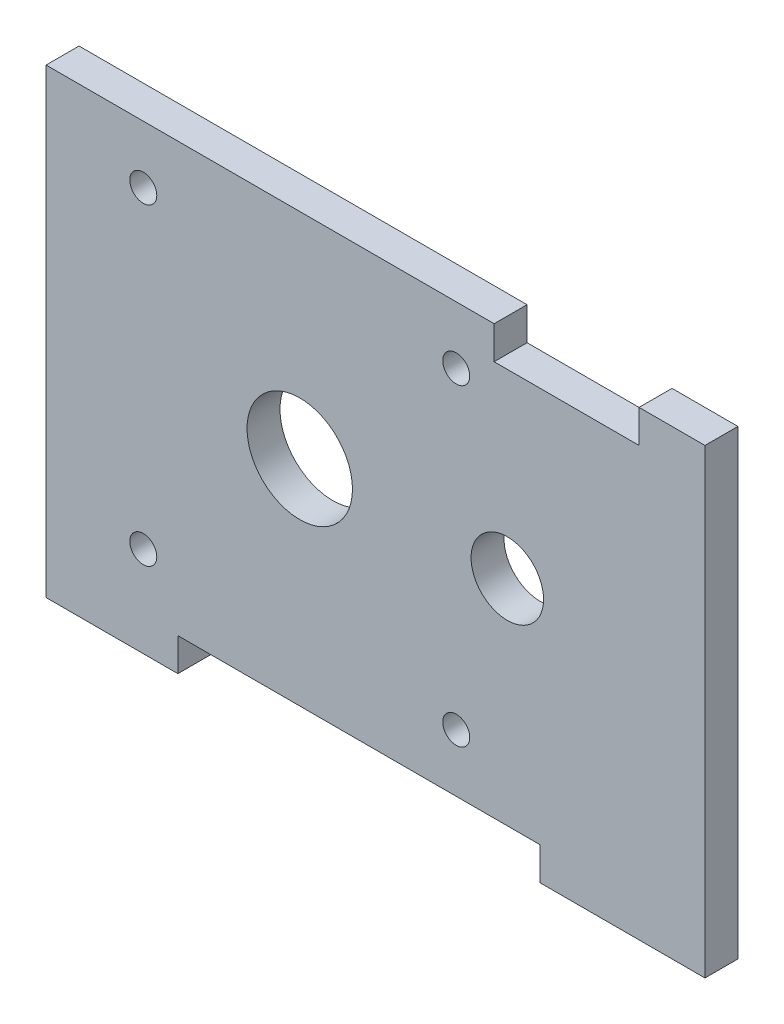
ISO-10303-21;
HEADER;
FILE_DESCRIPTION(('STEP AP214'),'2;1');
FILE_NAME('part.step','',(''),(''),'','','');
FILE_SCHEMA(('AUTOMOTIVE_DESIGN { 1 0 10303 214 1 1 1 1 }'));
ENDSEC;
DATA;
#1=APPLICATION_CONTEXT('core data for automotive mechanical design processes');
#2=APPLICATION_PROTOCOL_DEFINITION('international standard','automotive_design',2000,#1);
#3=PRODUCT_CONTEXT('',#1,'mechanical');
#4=PRODUCT('Part','Part','',(#3));
#5=PRODUCT_RELATED_PRODUCT_CATEGORY('part','',(#4));
#6=PRODUCT_DEFINITION_FORMATION('','',#4);
#7=PRODUCT_DEFINITION_CONTEXT('part definition',#1,'design');
#8=PRODUCT_DEFINITION('design','',#6,#7);
#9=PRODUCT_DEFINITION_SHAPE('','',#8);
#10=(LENGTH_UNIT() NAMED_UNIT(*) SI_UNIT(.MILLI.,.METRE.));
#11=(NAMED_UNIT(*) PLANE_ANGLE_UNIT() SI_UNIT($,.RADIAN.));
#12=(NAMED_UNIT(*) SI_UNIT($,.STERADIAN.) SOLID_ANGLE_UNIT());
#13=UNCERTAINTY_MEASURE_WITH_UNIT(LENGTH_MEASURE(1.E-05),#10,'distance_accuracy_value','');
#14=(GEOMETRIC_REPRESENTATION_CONTEXT(3) GLOBAL_UNCERTAINTY_ASSIGNED_CONTEXT((#13)) GLOBAL_UNIT_ASSIGNED_CONTEXT((#10,
#11,#12)) REPRESENTATION_CONTEXT('',''));
#15=CARTESIAN_POINT('',(0.,0.,0.));
#16=DIRECTION('',(0.,0.,1.));
#17=DIRECTION('',(1.,0.,0.));
#18=AXIS2_PLACEMENT_3D('',#15,#16,#17);
#19=CARTESIAN_POINT('',(0.,82.55,6.35));
#20=DIRECTION('',(0.,-1.,0.));
#21=DIRECTION('',(1.,0.,0.));
#22=AXIS2_PLACEMENT_3D('',#19,#20,#21);
#23=PLANE('',#22);
#24=DIRECTION('',(-1.,0.,0.));
#25=VECTOR('',#24,1.);
#26=CARTESIAN_POINT('',(0.,82.55,0.));
#27=LINE('',#26,#25);
#28=CARTESIAN_POINT('',(0.,82.55,0.));
#29=VERTEX_POINT('',#28);
#30=CARTESIAN_POINT('',(-12.7,82.55,0.));
#31=VERTEX_POINT('',#30);
#32=EDGE_CURVE('E197',#29,#31,#27,.T.);
#33=ORIENTED_EDGE('',*,*,#32,.T.);
#34=DIRECTION('',(0.,0.,-1.));
#35=VECTOR('',#34,1.);
#36=CARTESIAN_POINT('',(-12.7,82.55,6.35));
#37=LINE('',#36,#35);
#38=CARTESIAN_POINT('',(-12.7,82.55,6.35));
#39=VERTEX_POINT('',#38);
#40=EDGE_CURVE('E267',#39,#31,#37,.T.);
#41=ORIENTED_EDGE('',*,*,#40,.F.);
#42=DIRECTION('',(-1.,0.,0.));
#43=VECTOR('',#42,1.);
#44=CARTESIAN_POINT('',(0.,82.55,6.35));
#45=LINE('',#44,#43);
#46=CARTESIAN_POINT('',(0.,82.55,6.35));
#47=VERTEX_POINT('',#46);
#48=EDGE_CURVE('E167',#47,#39,#45,.T.);
#49=ORIENTED_EDGE('',*,*,#48,.F.);
#50=DIRECTION('',(0.,0.,-1.));
#51=VECTOR('',#50,1.);
#52=CARTESIAN_POINT('',(0.,82.55,6.35));
#53=LINE('',#52,#51);
#54=EDGE_CURVE('E143',#47,#29,#53,.T.);
#55=ORIENTED_EDGE('',*,*,#54,.T.);
#56=EDGE_LOOP('',(#33,#41,#49,#55));
#57=FACE_BOUND('',#56,.T.);
#58=ADVANCED_FACE('F43',(#57),#23,.F.);
#59=CARTESIAN_POINT('',(-127.,0.,6.35));
#60=DIRECTION('',(1.,0.,0.));
#61=DIRECTION('',(0.,1.,0.));
#62=AXIS2_PLACEMENT_3D('',#59,#60,#61);
#63=PLANE('',#62);
#64=DIRECTION('',(0.,-1.,0.));
#65=VECTOR('',#64,1.);
#66=CARTESIAN_POINT('',(-127.,0.,0.));
#67=LINE('',#66,#65);
#68=CARTESIAN_POINT('',(-127.,82.55,0.));
#69=VERTEX_POINT('',#68);
#70=CARTESIAN_POINT('',(-127.,-6.35,0.));
#71=VERTEX_POINT('',#70);
#72=EDGE_CURVE('E179',#69,#71,#67,.T.);
#73=ORIENTED_EDGE('',*,*,#72,.T.);
#74=DIRECTION('',(0.,0.,-1.));
#75=VECTOR('',#74,1.);
#76=CARTESIAN_POINT('',(-127.,-6.35,6.35));
#77=LINE('',#76,#75);
#78=CARTESIAN_POINT('',(-127.,-6.35,6.35));
#79=VERTEX_POINT('',#78);
#80=EDGE_CURVE('E11',#79,#71,#77,.T.);
#81=ORIENTED_EDGE('',*,*,#80,.F.);
#82=DIRECTION('',(0.,-1.,0.));
#83=VECTOR('',#82,1.);
#84=CARTESIAN_POINT('',(-127.,0.,6.35));
#85=LINE('',#84,#83);
#86=CARTESIAN_POINT('',(-127.,82.55,6.35));
#87=VERTEX_POINT('',#86);
#88=EDGE_CURVE('E232',#87,#79,#85,.T.);
#89=ORIENTED_EDGE('',*,*,#88,.F.);
#90=DIRECTION('',(0.,0.,-1.));
#91=VECTOR('',#90,1.);
#92=CARTESIAN_POINT('',(-127.,82.55,6.35));
#93=LINE('',#92,#91);
#94=EDGE_CURVE('E169',#87,#69,#93,.T.);
#95=ORIENTED_EDGE('',*,*,#94,.T.);
#96=EDGE_LOOP('',(#73,#81,#89,#95));
#97=FACE_BOUND('',#96,.T.);
#98=ADVANCED_FACE('F330',(#97),#63,.F.);
#99=CARTESIAN_POINT('',(0.,-6.35,6.35));
#100=DIRECTION('',(0.,1.,0.));
#101=DIRECTION('',(0.,0.,1.));
#102=AXIS2_PLACEMENT_3D('',#99,#100,#101);
#103=PLANE('',#102);
#104=DIRECTION('',(1.,0.,0.));
#105=VECTOR('',#104,1.);
#106=CARTESIAN_POINT('',(0.,-6.35,0.));
#107=LINE('',#106,#105);
#108=CARTESIAN_POINT('',(-101.6,-6.35,0.));
#109=VERTEX_POINT('',#108);
#110=EDGE_CURVE('E183',#71,#109,#107,.T.);
#111=ORIENTED_EDGE('',*,*,#110,.T.);
#112=DIRECTION('',(0.,0.,-1.));
#113=VECTOR('',#112,1.);
#114=CARTESIAN_POINT('',(-101.6,-6.35,6.35));
#115=LINE('',#114,#113);
#116=CARTESIAN_POINT('',(-101.6,-6.35,6.35));
#117=VERTEX_POINT('',#116);
#118=EDGE_CURVE('E51',#117,#109,#115,.T.);
#119=ORIENTED_EDGE('',*,*,#118,.F.);
#120=DIRECTION('',(1.,0.,0.));
#121=VECTOR('',#120,1.);
#122=CARTESIAN_POINT('',(0.,-6.35,6.35));
#123=LINE('',#122,#121);
#124=EDGE_CURVE('E114',#79,#117,#123,.T.);
#125=ORIENTED_EDGE('',*,*,#124,.F.);
#126=ORIENTED_EDGE('',*,*,#80,.T.);
#127=EDGE_LOOP('',(#111,#119,#125,#126));
#128=FACE_BOUND('',#127,.T.);
#129=ADVANCED_FACE('F331',(#128),#103,.F.);
#130=CARTESIAN_POINT('',(-101.6,0.,6.35));
#131=DIRECTION('',(-1.,0.,0.));
#132=DIRECTION('',(0.,0.,1.));
#133=AXIS2_PLACEMENT_3D('',#130,#131,#132);
#134=PLANE('',#133);
#135=DIRECTION('',(0.,1.,0.));
#136=VECTOR('',#135,1.);
#137=CARTESIAN_POINT('',(-101.6,0.,0.));
#138=LINE('',#137,#136);
#139=CARTESIAN_POINT('',(-101.6,0.,0.));
#140=VERTEX_POINT('',#139);
#141=EDGE_CURVE('E185',#109,#140,#138,.T.);
#142=ORIENTED_EDGE('',*,*,#141,.T.);
#143=DIRECTION('',(0.,0.,-1.));
#144=VECTOR('',#143,1.);
#145=CARTESIAN_POINT('',(-101.6,0.,6.35));
#146=LINE('',#145,#144);
#147=CARTESIAN_POINT('',(-101.6,0.,6.35));
#148=VERTEX_POINT('',#147);
#149=EDGE_CURVE('E207',#148,#140,#146,.T.);
#150=ORIENTED_EDGE('',*,*,#149,.F.);
#151=DIRECTION('',(0.,1.,0.));
#152=VECTOR('',#151,1.);
#153=CARTESIAN_POINT('',(-101.6,0.,6.35));
#154=LINE('',#153,#152);
#155=EDGE_CURVE('E215',#117,#148,#154,.T.);
#156=ORIENTED_EDGE('',*,*,#155,.F.);
#157=ORIENTED_EDGE('',*,*,#118,.T.);
#158=EDGE_LOOP('',(#142,#150,#156,#157));
#159=FACE_BOUND('',#158,.T.);
#160=ADVANCED_FACE('F213',(#159),#134,.F.);
#161=CARTESIAN_POINT('',(0.,0.,6.35));
#162=DIRECTION('',(0.,1.,0.));
#163=DIRECTION('',(0.,0.,1.));
#164=AXIS2_PLACEMENT_3D('',#161,#162,#163);
#165=PLANE('',#164);
#166=DIRECTION('',(1.,0.,0.));
#167=VECTOR('',#166,1.);
#168=CARTESIAN_POINT('',(0.,0.,0.));
#169=LINE('',#168,#167);
#170=CARTESIAN_POINT('',(-31.75,0.,0.));
#171=VERTEX_POINT('',#170);
#172=EDGE_CURVE('E187',#140,#171,#169,.T.);
#173=ORIENTED_EDGE('',*,*,#172,.T.);
#174=DIRECTION('',(0.,0.,-1.));
#175=VECTOR('',#174,1.);
#176=CARTESIAN_POINT('',(-31.75,0.,6.35));
#177=LINE('',#176,#175);
#178=CARTESIAN_POINT('',(-31.75,0.,6.35));
#179=VERTEX_POINT('',#178);
#180=EDGE_CURVE('E205',#179,#171,#177,.T.);
#181=ORIENTED_EDGE('',*,*,#180,.F.);
#182=DIRECTION('',(1.,0.,0.));
#183=VECTOR('',#182,1.);
#184=CARTESIAN_POINT('',(0.,0.,6.35));
#185=LINE('',#184,#183);
#186=EDGE_CURVE('E163',#148,#179,#185,.T.);
#187=ORIENTED_EDGE('',*,*,#186,.F.);
#188=ORIENTED_EDGE('',*,*,#149,.T.);
#189=EDGE_LOOP('',(#173,#181,#187,#188));
#190=FACE_BOUND('',#189,.T.);
#191=ADVANCED_FACE('F224',(#190),#165,.F.);
#192=CARTESIAN_POINT('',(-31.75,0.,6.35));
#193=DIRECTION('',(-1.,0.,0.));
#194=DIRECTION('',(0.,0.,1.));
#195=AXIS2_PLACEMENT_3D('',#192,#193,#194);
#196=PLANE('',#195);
#197=DIRECTION('',(0.,1.,0.));
#198=VECTOR('',#197,1.);
#199=CARTESIAN_POINT('',(-31.75,0.,0.));
#200=LINE('',#199,#198);
#201=CARTESIAN_POINT('',(-31.75,-6.35,0.));
#202=VERTEX_POINT('',#201);
#203=EDGE_CURVE('E191',#202,#171,#200,.T.);
#204=ORIENTED_EDGE('',*,*,#203,.F.);
#205=DIRECTION('',(0.,0.,-1.));
#206=VECTOR('',#205,1.);
#207=CARTESIAN_POINT('',(-31.75,-6.35,6.35));
#208=LINE('',#207,#206);
#209=CARTESIAN_POINT('',(-31.75,-6.35,6.35));
#210=VERTEX_POINT('',#209);
#211=EDGE_CURVE('E142',#210,#202,#208,.T.);
#212=ORIENTED_EDGE('',*,*,#211,.F.);
#213=DIRECTION('',(0.,1.,0.));
#214=VECTOR('',#213,1.);
#215=CARTESIAN_POINT('',(-31.75,0.,6.35));
#216=LINE('',#215,#214);
#217=EDGE_CURVE('E158',#210,#179,#216,.T.);
#218=ORIENTED_EDGE('',*,*,#217,.T.);
#219=ORIENTED_EDGE('',*,*,#180,.T.);
#220=EDGE_LOOP('',(#204,#212,#218,#219));
#221=FACE_BOUND('',#220,.T.);
#222=ADVANCED_FACE('F490',(#221),#196,.T.);
#223=CARTESIAN_POINT('',(0.,-6.35,6.35));
#224=DIRECTION('',(0.,-1.,0.));
#225=DIRECTION('',(1.,0.,0.));
#226=AXIS2_PLACEMENT_3D('',#223,#224,#225);
#227=PLANE('',#226);
#228=DIRECTION('',(-1.,0.,0.));
#229=VECTOR('',#228,1.);
#230=CARTESIAN_POINT('',(0.,-6.35,0.));
#231=LINE('',#230,#229);
#232=CARTESIAN_POINT('',(0.,-6.35,0.));
#233=VERTEX_POINT('',#232);
#234=EDGE_CURVE('E138',#233,#202,#231,.T.);
#235=ORIENTED_EDGE('',*,*,#234,.F.);
#236=DIRECTION('',(0.,0.,-1.));
#237=VECTOR('',#236,1.);
#238=CARTESIAN_POINT('',(0.,-6.35,6.35));
#239=LINE('',#238,#237);
#240=CARTESIAN_POINT('',(0.,-6.35,6.35));
#241=VERTEX_POINT('',#240);
#242=EDGE_CURVE('E132',#241,#233,#239,.T.);
#243=ORIENTED_EDGE('',*,*,#242,.F.);
#244=DIRECTION('',(-1.,0.,0.));
#245=VECTOR('',#244,1.);
#246=CARTESIAN_POINT('',(0.,-6.35,6.35));
#247=LINE('',#246,#245);
#248=EDGE_CURVE('E136',#241,#210,#247,.T.);
#249=ORIENTED_EDGE('',*,*,#248,.T.);
#250=ORIENTED_EDGE('',*,*,#211,.T.);
#251=EDGE_LOOP('',(#235,#243,#249,#250));
#252=FACE_BOUND('',#251,.T.);
#253=ADVANCED_FACE('F134',(#252),#227,.T.);
#254=CARTESIAN_POINT('',(0.,0.,6.35));
#255=DIRECTION('',(-1.,0.,0.));
#256=DIRECTION('',(0.,0.,1.));
#257=AXIS2_PLACEMENT_3D('',#254,#255,#256);
#258=PLANE('',#257);
#259=DIRECTION('',(0.,1.,0.));
#260=VECTOR('',#259,1.);
#261=CARTESIAN_POINT('',(0.,0.,0.));
#262=LINE('',#261,#260);
#263=EDGE_CURVE('E195',#233,#29,#262,.T.);
#264=ORIENTED_EDGE('',*,*,#263,.T.);
#265=ORIENTED_EDGE('',*,*,#54,.F.);
#266=DIRECTION('',(0.,1.,0.));
#267=VECTOR('',#266,1.);
#268=CARTESIAN_POINT('',(0.,0.,6.35));
#269=LINE('',#268,#267);
#270=EDGE_CURVE('E146',#241,#47,#269,.T.);
#271=ORIENTED_EDGE('',*,*,#270,.F.);
#272=ORIENTED_EDGE('',*,*,#242,.T.);
#273=EDGE_LOOP('',(#264,#265,#271,#272));
#274=FACE_BOUND('',#273,.T.);
#275=ADVANCED_FACE('F147',(#274),#258,.F.);
#276=CARTESIAN_POINT('',(-38.1,41.275,6.35));
#277=DIRECTION('',(0.,0.,-1.));
#278=DIRECTION('',(-1.,0.,0.));
#279=AXIS2_PLACEMENT_3D('',#276,#277,#278);
#280=CYLINDRICAL_SURFACE('',#279,6.98500000000001);
#281=CARTESIAN_POINT('',(-38.1,41.275,6.35));
#282=DIRECTION('',(0.,0.,1.));
#283=DIRECTION('',(1.,0.,0.));
#284=AXIS2_PLACEMENT_3D('',#281,#282,#283);
#285=CIRCLE('',#284,6.98500000000001);
#286=CARTESIAN_POINT('',(-31.115,41.275,6.35));
#287=VERTEX_POINT('',#286);
#288=EDGE_CURVE('E235',#287,#287,#285,.T.);
#289=ORIENTED_EDGE('',*,*,#288,.T.);
#290=EDGE_LOOP('',(#289));
#291=FACE_BOUND('',#290,.T.);
#292=CARTESIAN_POINT('',(-38.1,41.275,0.));
#293=DIRECTION('',(0.,0.,1.));
#294=DIRECTION('',(1.,0.,0.));
#295=AXIS2_PLACEMENT_3D('',#292,#293,#294);
#296=CIRCLE('',#295,6.98500000000001);
#297=CARTESIAN_POINT('',(-31.115,41.275,0.));
#298=VERTEX_POINT('',#297);
#299=EDGE_CURVE('E174',#298,#298,#296,.T.);
#300=ORIENTED_EDGE('',*,*,#299,.F.);
#301=EDGE_LOOP('',(#300));
#302=FACE_BOUND('',#301,.T.);
#303=ADVANCED_FACE('F352',(#291,#302),#280,.F.);
#304=CARTESIAN_POINT('',(-78.105,41.275,6.35));
#305=DIRECTION('',(0.,0.,-1.));
#306=DIRECTION('',(-1.,0.,0.));
#307=AXIS2_PLACEMENT_3D('',#304,#305,#306);
#308=CYLINDRICAL_SURFACE('',#307,10.16);
#309=CARTESIAN_POINT('',(-78.105,41.275,6.35));
#310=DIRECTION('',(0.,0.,1.));
#311=DIRECTION('',(1.,0.,0.));
#312=AXIS2_PLACEMENT_3D('',#309,#310,#311);
#313=CIRCLE('',#312,10.16);
#314=CARTESIAN_POINT('',(-67.945,41.275,6.35));
#315=VERTEX_POINT('',#314);
#316=EDGE_CURVE('E200',#315,#315,#313,.T.);
#317=ORIENTED_EDGE('',*,*,#316,.T.);
#318=EDGE_LOOP('',(#317));
#319=FACE_BOUND('',#318,.T.);
#320=CARTESIAN_POINT('',(-78.105,41.275,0.));
#321=DIRECTION('',(0.,0.,1.));
#322=DIRECTION('',(1.,0.,0.));
#323=AXIS2_PLACEMENT_3D('',#320,#321,#322);
#324=CIRCLE('',#323,10.16);
#325=CARTESIAN_POINT('',(-67.945,41.275,0.));
#326=VERTEX_POINT('',#325);
#327=EDGE_CURVE('E170',#326,#326,#324,.T.);
#328=ORIENTED_EDGE('',*,*,#327,.F.);
#329=EDGE_LOOP('',(#328));
#330=FACE_BOUND('',#329,.T.);
#331=ADVANCED_FACE('F45',(#319,#330),#308,.F.);
#332=CARTESIAN_POINT('',(-40.64,82.55,6.35));
#333=VERTEX_POINT('',#332);
#334=EDGE_CURVE('E70',#333,#87,#45,.T.);
#335=ORIENTED_EDGE('',*,*,#334,.F.);
#336=DIRECTION('',(0.,0.,-1.));
#337=VECTOR('',#336,1.);
#338=CARTESIAN_POINT('',(-40.64,82.55,6.35));
#339=LINE('',#338,#337);
#340=CARTESIAN_POINT('',(-40.64,82.55,0.));
#341=VERTEX_POINT('',#340);
#342=EDGE_CURVE('E278',#333,#341,#339,.T.);
#343=ORIENTED_EDGE('',*,*,#342,.T.);
#344=EDGE_CURVE('E106',#341,#69,#27,.T.);
#345=ORIENTED_EDGE('',*,*,#344,.T.);
#346=ORIENTED_EDGE('',*,*,#94,.F.);
#347=EDGE_LOOP('',(#335,#343,#345,#346));
#348=FACE_BOUND('',#347,.T.);
#349=ADVANCED_FACE('F324',(#348),#23,.F.);
#350=CARTESIAN_POINT('',(0.,0.,6.35));
#351=DIRECTION('',(0.,0.,1.));
#352=DIRECTION('',(1.,0.,0.));
#353=AXIS2_PLACEMENT_3D('',#350,#351,#352);
#354=PLANE('',#353);
#355=DIRECTION('',(0.,-1.,0.));
#356=VECTOR('',#355,1.);
#357=CARTESIAN_POINT('',(-12.7,82.55,6.35));
#358=LINE('',#357,#356);
#359=CARTESIAN_POINT('',(-12.7,76.2,6.35));
#360=VERTEX_POINT('',#359);
#361=EDGE_CURVE('E285',#39,#360,#358,.T.);
#362=ORIENTED_EDGE('',*,*,#361,.T.);
#363=DIRECTION('',(-1.,0.,0.));
#364=VECTOR('',#363,1.);
#365=CARTESIAN_POINT('',(-12.7,76.2,6.35));
#366=LINE('',#365,#364);
#367=CARTESIAN_POINT('',(-40.64,76.2,6.35));
#368=VERTEX_POINT('',#367);
#369=EDGE_CURVE('E293',#360,#368,#366,.T.);
#370=ORIENTED_EDGE('',*,*,#369,.T.);
#371=DIRECTION('',(0.,1.,0.));
#372=VECTOR('',#371,1.);
#373=CARTESIAN_POINT('',(-40.64,82.55,6.35));
#374=LINE('',#373,#372);
#375=EDGE_CURVE('E274',#368,#333,#374,.T.);
#376=ORIENTED_EDGE('',*,*,#375,.T.);
#377=ORIENTED_EDGE('',*,*,#334,.T.);
#378=ORIENTED_EDGE('',*,*,#88,.T.);
#379=ORIENTED_EDGE('',*,*,#124,.T.);
#380=ORIENTED_EDGE('',*,*,#155,.T.);
#381=ORIENTED_EDGE('',*,*,#186,.T.);
#382=ORIENTED_EDGE('',*,*,#217,.F.);
#383=ORIENTED_EDGE('',*,*,#248,.F.);
#384=ORIENTED_EDGE('',*,*,#270,.T.);
#385=ORIENTED_EDGE('',*,*,#48,.T.);
#386=EDGE_LOOP('',(#362,#370,#376,#377,#378,#379,#380,#381,#382,#383,#384,#385));
#387=FACE_BOUND('',#386,.T.);
#388=CARTESIAN_POINT('',(-47.9425,11.1125,6.35));
#389=DIRECTION('',(0.,0.,1.));
#390=DIRECTION('',(1.,0.,0.));
#391=AXIS2_PLACEMENT_3D('',#388,#389,#390);
#392=CIRCLE('',#391,2.6035);
#393=CARTESIAN_POINT('',(-45.339,11.1125,6.35));
#394=VERTEX_POINT('',#393);
#395=EDGE_CURVE('E263',#394,#394,#392,.T.);
#396=ORIENTED_EDGE('',*,*,#395,.F.);
#397=EDGE_LOOP('',(#396));
#398=FACE_BOUND('',#397,.T.);
#399=CARTESIAN_POINT('',(-108.2675,11.1125,6.35));
#400=DIRECTION('',(0.,0.,1.));
#401=DIRECTION('',(1.,0.,0.));
#402=AXIS2_PLACEMENT_3D('',#399,#400,#401);
#403=CIRCLE('',#402,2.60349999999999);
#404=CARTESIAN_POINT('',(-105.664,11.1125,6.35));
#405=VERTEX_POINT('',#404);
#406=EDGE_CURVE('E257',#405,#405,#403,.T.);
#407=ORIENTED_EDGE('',*,*,#406,.F.);
#408=EDGE_LOOP('',(#407));
#409=FACE_BOUND('',#408,.T.);
#410=CARTESIAN_POINT('',(-47.9425,71.4375,6.35));
#411=DIRECTION('',(0.,0.,1.));
#412=DIRECTION('',(1.,0.,0.));
#413=AXIS2_PLACEMENT_3D('',#410,#411,#412);
#414=CIRCLE('',#413,2.6035);
#415=CARTESIAN_POINT('',(-45.339,71.4375,6.35));
#416=VERTEX_POINT('',#415);
#417=EDGE_CURVE('E249',#416,#416,#414,.T.);
#418=ORIENTED_EDGE('',*,*,#417,.F.);
#419=EDGE_LOOP('',(#418));
#420=FACE_BOUND('',#419,.T.);
#421=CARTESIAN_POINT('',(-108.2675,71.4375,6.35));
#422=DIRECTION('',(0.,0.,1.));
#423=DIRECTION('',(1.,0.,0.));
#424=AXIS2_PLACEMENT_3D('',#421,#422,#423);
#425=CIRCLE('',#424,2.60349999999999);
#426=CARTESIAN_POINT('',(-105.664,71.4375,6.35));
#427=VERTEX_POINT('',#426);
#428=EDGE_CURVE('E241',#427,#427,#425,.T.);
#429=ORIENTED_EDGE('',*,*,#428,.F.);
#430=EDGE_LOOP('',(#429));
#431=FACE_BOUND('',#430,.T.);
#432=ORIENTED_EDGE('',*,*,#316,.F.);
#433=EDGE_LOOP('',(#432));
#434=FACE_BOUND('',#433,.T.);
#435=ORIENTED_EDGE('',*,*,#288,.F.);
#436=EDGE_LOOP('',(#435));
#437=FACE_BOUND('',#436,.T.);
#438=ADVANCED_FACE('F155',(#387,#398,#409,#420,#431,#434,#437),#354,.T.);
#439=CARTESIAN_POINT('',(0.,0.,0.));
#440=DIRECTION('',(0.,0.,1.));
#441=DIRECTION('',(1.,0.,0.));
#442=AXIS2_PLACEMENT_3D('',#439,#440,#441);
#443=PLANE('',#442);
#444=CARTESIAN_POINT('',(-47.9425,11.1125,0.));
#445=DIRECTION('',(0.,0.,1.));
#446=DIRECTION('',(1.,0.,0.));
#447=AXIS2_PLACEMENT_3D('',#444,#445,#446);
#448=CIRCLE('',#447,2.6035);
#449=CARTESIAN_POINT('',(-45.339,11.1125,0.));
#450=VERTEX_POINT('',#449);
#451=EDGE_CURVE('E260',#450,#450,#448,.T.);
#452=ORIENTED_EDGE('',*,*,#451,.T.);
#453=EDGE_LOOP('',(#452));
#454=FACE_BOUND('',#453,.T.);
#455=CARTESIAN_POINT('',(-108.2675,11.1125,0.));
#456=DIRECTION('',(0.,0.,1.));
#457=DIRECTION('',(1.,0.,0.));
#458=AXIS2_PLACEMENT_3D('',#455,#456,#457);
#459=CIRCLE('',#458,2.60349999999999);
#460=CARTESIAN_POINT('',(-105.664,11.1125,0.));
#461=VERTEX_POINT('',#460);
#462=EDGE_CURVE('E253',#461,#461,#459,.T.);
#463=ORIENTED_EDGE('',*,*,#462,.T.);
#464=EDGE_LOOP('',(#463));
#465=FACE_BOUND('',#464,.T.);
#466=CARTESIAN_POINT('',(-47.9425,71.4375,0.));
#467=DIRECTION('',(0.,0.,1.));
#468=DIRECTION('',(1.,0.,0.));
#469=AXIS2_PLACEMENT_3D('',#466,#467,#468);
#470=CIRCLE('',#469,2.6035);
#471=CARTESIAN_POINT('',(-45.339,71.4375,0.));
#472=VERTEX_POINT('',#471);
#473=EDGE_CURVE('E245',#472,#472,#470,.T.);
#474=ORIENTED_EDGE('',*,*,#473,.T.);
#475=EDGE_LOOP('',(#474));
#476=FACE_BOUND('',#475,.T.);
#477=CARTESIAN_POINT('',(-108.2675,71.4375,0.));
#478=DIRECTION('',(0.,0.,1.));
#479=DIRECTION('',(1.,0.,0.));
#480=AXIS2_PLACEMENT_3D('',#477,#478,#479);
#481=CIRCLE('',#480,2.60349999999999);
#482=CARTESIAN_POINT('',(-105.664,71.4375,0.));
#483=VERTEX_POINT('',#482);
#484=EDGE_CURVE('E175',#483,#483,#481,.T.);
#485=ORIENTED_EDGE('',*,*,#484,.T.);
#486=EDGE_LOOP('',(#485));
#487=FACE_BOUND('',#486,.T.);
#488=ORIENTED_EDGE('',*,*,#327,.T.);
#489=EDGE_LOOP('',(#488));
#490=FACE_BOUND('',#489,.T.);
#491=ORIENTED_EDGE('',*,*,#299,.T.);
#492=EDGE_LOOP('',(#491));
#493=FACE_BOUND('',#492,.T.);
#494=DIRECTION('',(-1.,0.,0.));
#495=VECTOR('',#494,1.);
#496=CARTESIAN_POINT('',(-12.7,76.2,0.));
#497=LINE('',#496,#495);
#498=CARTESIAN_POINT('',(-12.7,76.2,0.));
#499=VERTEX_POINT('',#498);
#500=CARTESIAN_POINT('',(-40.64,76.2,0.));
#501=VERTEX_POINT('',#500);
#502=EDGE_CURVE('E286',#499,#501,#497,.T.);
#503=ORIENTED_EDGE('',*,*,#502,.F.);
#504=DIRECTION('',(0.,-1.,0.));
#505=VECTOR('',#504,1.);
#506=CARTESIAN_POINT('',(-12.7,82.55,0.));
#507=LINE('',#506,#505);
#508=EDGE_CURVE('E58',#31,#499,#507,.T.);
#509=ORIENTED_EDGE('',*,*,#508,.F.);
#510=ORIENTED_EDGE('',*,*,#32,.F.);
#511=ORIENTED_EDGE('',*,*,#263,.F.);
#512=ORIENTED_EDGE('',*,*,#234,.T.);
#513=ORIENTED_EDGE('',*,*,#203,.T.);
#514=ORIENTED_EDGE('',*,*,#172,.F.);
#515=ORIENTED_EDGE('',*,*,#141,.F.);
#516=ORIENTED_EDGE('',*,*,#110,.F.);
#517=ORIENTED_EDGE('',*,*,#72,.F.);
#518=ORIENTED_EDGE('',*,*,#344,.F.);
#519=DIRECTION('',(0.,1.,0.));
#520=VECTOR('',#519,1.);
#521=CARTESIAN_POINT('',(-40.64,82.55,0.));
#522=LINE('',#521,#520);
#523=EDGE_CURVE('E282',#501,#341,#522,.T.);
#524=ORIENTED_EDGE('',*,*,#523,.F.);
#525=EDGE_LOOP('',(#503,#509,#510,#511,#512,#513,#514,#515,#516,#517,#518,#524));
#526=FACE_BOUND('',#525,.T.);
#527=ADVANCED_FACE('F219',(#454,#465,#476,#487,#490,#493,#526),#443,.F.);
#528=CARTESIAN_POINT('',(-108.2675,71.4375,0.));
#529=DIRECTION('',(0.,0.,1.));
#530=DIRECTION('',(1.,0.,0.));
#531=AXIS2_PLACEMENT_3D('',#528,#529,#530);
#532=CYLINDRICAL_SURFACE('',#531,2.60349999999999);
#533=ORIENTED_EDGE('',*,*,#484,.F.);
#534=EDGE_LOOP('',(#533));
#535=FACE_BOUND('',#534,.T.);
#536=ORIENTED_EDGE('',*,*,#428,.T.);
#537=EDGE_LOOP('',(#536));
#538=FACE_BOUND('',#537,.T.);
#539=ADVANCED_FACE('F364',(#535,#538),#532,.F.);
#540=CARTESIAN_POINT('',(-47.9425,71.4375,0.));
#541=DIRECTION('',(0.,0.,1.));
#542=DIRECTION('',(1.,0.,0.));
#543=AXIS2_PLACEMENT_3D('',#540,#541,#542);
#544=CYLINDRICAL_SURFACE('',#543,2.6035);
#545=ORIENTED_EDGE('',*,*,#473,.F.);
#546=EDGE_LOOP('',(#545));
#547=FACE_BOUND('',#546,.T.);
#548=ORIENTED_EDGE('',*,*,#417,.T.);
#549=EDGE_LOOP('',(#548));
#550=FACE_BOUND('',#549,.T.);
#551=ADVANCED_FACE('F371',(#547,#550),#544,.F.);
#552=CARTESIAN_POINT('',(-108.2675,11.1125,0.));
#553=DIRECTION('',(0.,0.,1.));
#554=DIRECTION('',(1.,0.,0.));
#555=AXIS2_PLACEMENT_3D('',#552,#553,#554);
#556=CYLINDRICAL_SURFACE('',#555,2.60349999999999);
#557=ORIENTED_EDGE('',*,*,#462,.F.);
#558=EDGE_LOOP('',(#557));
#559=FACE_BOUND('',#558,.T.);
#560=ORIENTED_EDGE('',*,*,#406,.T.);
#561=EDGE_LOOP('',(#560));
#562=FACE_BOUND('',#561,.T.);
#563=ADVANCED_FACE('F378',(#559,#562),#556,.F.);
#564=CARTESIAN_POINT('',(-47.9425,11.1125,0.));
#565=DIRECTION('',(0.,0.,1.));
#566=DIRECTION('',(1.,0.,0.));
#567=AXIS2_PLACEMENT_3D('',#564,#565,#566);
#568=CYLINDRICAL_SURFACE('',#567,2.6035);
#569=ORIENTED_EDGE('',*,*,#451,.F.);
#570=EDGE_LOOP('',(#569));
#571=FACE_BOUND('',#570,.T.);
#572=ORIENTED_EDGE('',*,*,#395,.T.);
#573=EDGE_LOOP('',(#572));
#574=FACE_BOUND('',#573,.T.);
#575=ADVANCED_FACE('F382',(#571,#574),#568,.F.);
#576=CARTESIAN_POINT('',(-12.7,82.55,6.35));
#577=DIRECTION('',(1.,0.,0.));
#578=DIRECTION('',(0.,0.,-1.));
#579=AXIS2_PLACEMENT_3D('',#576,#577,#578);
#580=PLANE('',#579);
#581=ORIENTED_EDGE('',*,*,#508,.T.);
#582=DIRECTION('',(0.,0.,-1.));
#583=VECTOR('',#582,1.);
#584=CARTESIAN_POINT('',(-12.7,76.2,6.35));
#585=LINE('',#584,#583);
#586=EDGE_CURVE('E271',#360,#499,#585,.T.);
#587=ORIENTED_EDGE('',*,*,#586,.F.);
#588=ORIENTED_EDGE('',*,*,#361,.F.);
#589=ORIENTED_EDGE('',*,*,#40,.T.);
#590=EDGE_LOOP('',(#581,#587,#588,#589));
#591=FACE_BOUND('',#590,.T.);
#592=ADVANCED_FACE('F303',(#591),#580,.F.);
#593=CARTESIAN_POINT('',(-40.64,82.55,6.35));
#594=DIRECTION('',(-1.,0.,0.));
#595=DIRECTION('',(0.,0.,1.));
#596=AXIS2_PLACEMENT_3D('',#593,#594,#595);
#597=PLANE('',#596);
#598=ORIENTED_EDGE('',*,*,#523,.T.);
#599=ORIENTED_EDGE('',*,*,#342,.F.);
#600=ORIENTED_EDGE('',*,*,#375,.F.);
#601=DIRECTION('',(0.,0.,-1.));
#602=VECTOR('',#601,1.);
#603=CARTESIAN_POINT('',(-40.64,76.2,6.35));
#604=LINE('',#603,#602);
#605=EDGE_CURVE('E273',#368,#501,#604,.T.);
#606=ORIENTED_EDGE('',*,*,#605,.T.);
#607=EDGE_LOOP('',(#598,#599,#600,#606));
#608=FACE_BOUND('',#607,.T.);
#609=ADVANCED_FACE('F323',(#608),#597,.F.);
#610=CARTESIAN_POINT('',(-12.7,76.2,6.35));
#611=DIRECTION('',(0.,-1.,0.));
#612=DIRECTION('',(0.,0.,-1.));
#613=AXIS2_PLACEMENT_3D('',#610,#611,#612);
#614=PLANE('',#613);
#615=ORIENTED_EDGE('',*,*,#502,.T.);
#616=ORIENTED_EDGE('',*,*,#605,.F.);
#617=ORIENTED_EDGE('',*,*,#369,.F.);
#618=ORIENTED_EDGE('',*,*,#586,.T.);
#619=EDGE_LOOP('',(#615,#616,#617,#618));
#620=FACE_BOUND('',#619,.T.);
#621=ADVANCED_FACE('F313',(#620),#614,.F.);
#622=CLOSED_SHELL('',(#58,#98,#129,#160,#191,#222,#253,#275,#303,#331,#349,#438,#527,#539,#551,
#563,#575,#592,#609,#621));
#623=MANIFOLD_SOLID_BREP('B2',#622);
#624=ADVANCED_BREP_SHAPE_REPRESENTATION('',(#18,#623),#14);
#625=SHAPE_DEFINITION_REPRESENTATION(#9,#624);
ENDSEC;
END-ISO-10303-21;
